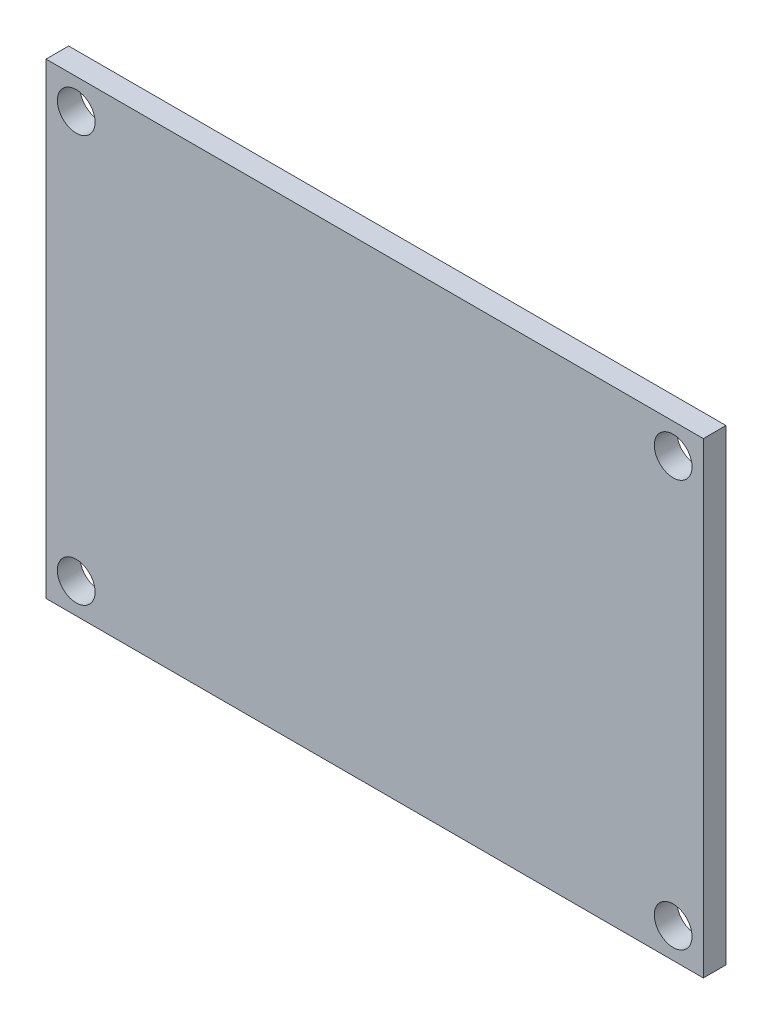
ISO-10303-21;
HEADER;
FILE_DESCRIPTION(('STEP AP214'),'2;1');
FILE_NAME('part.step','',(''),(''),'','','');
FILE_SCHEMA(('AUTOMOTIVE_DESIGN { 1 0 10303 214 1 1 1 1 }'));
ENDSEC;
DATA;
#1=APPLICATION_CONTEXT('core data for automotive mechanical design processes');
#2=APPLICATION_PROTOCOL_DEFINITION('international standard','automotive_design',2000,#1);
#3=PRODUCT_CONTEXT('',#1,'mechanical');
#4=PRODUCT('Part','Part','',(#3));
#5=PRODUCT_RELATED_PRODUCT_CATEGORY('part','',(#4));
#6=PRODUCT_DEFINITION_FORMATION('','',#4);
#7=PRODUCT_DEFINITION_CONTEXT('part definition',#1,'design');
#8=PRODUCT_DEFINITION('design','',#6,#7);
#9=PRODUCT_DEFINITION_SHAPE('','',#8);
#10=(LENGTH_UNIT() NAMED_UNIT(*) SI_UNIT(.MILLI.,.METRE.));
#11=(NAMED_UNIT(*) PLANE_ANGLE_UNIT() SI_UNIT($,.RADIAN.));
#12=(NAMED_UNIT(*) SI_UNIT($,.STERADIAN.) SOLID_ANGLE_UNIT());
#13=UNCERTAINTY_MEASURE_WITH_UNIT(LENGTH_MEASURE(1.E-05),#10,'distance_accuracy_value','');
#14=(GEOMETRIC_REPRESENTATION_CONTEXT(3) GLOBAL_UNCERTAINTY_ASSIGNED_CONTEXT((#13)) GLOBAL_UNIT_ASSIGNED_CONTEXT((#10,
#11,#12)) REPRESENTATION_CONTEXT('',''));
#15=CARTESIAN_POINT('',(0.,0.,0.));
#16=DIRECTION('',(0.,0.,1.));
#17=DIRECTION('',(1.,0.,0.));
#18=AXIS2_PLACEMENT_3D('',#15,#16,#17);
#19=CARTESIAN_POINT('',(-43.55,30.95,3.));
#20=DIRECTION('',(1.,0.,0.));
#21=DIRECTION('',(0.,0.,-1.));
#22=AXIS2_PLACEMENT_3D('',#19,#20,#21);
#23=PLANE('',#22);
#24=DIRECTION('',(0.,-1.,0.));
#25=VECTOR('',#24,1.);
#26=CARTESIAN_POINT('',(-43.55,30.95,0.));
#27=LINE('',#26,#25);
#28=CARTESIAN_POINT('',(-43.55,30.95,0.));
#29=VERTEX_POINT('',#28);
#30=CARTESIAN_POINT('',(-43.55,-30.95,0.));
#31=VERTEX_POINT('',#30);
#32=EDGE_CURVE('E101',#29,#31,#27,.T.);
#33=ORIENTED_EDGE('',*,*,#32,.T.);
#34=DIRECTION('',(0.,0.,-1.));
#35=VECTOR('',#34,1.);
#36=CARTESIAN_POINT('',(-43.55,-30.95,3.));
#37=LINE('',#36,#35);
#38=CARTESIAN_POINT('',(-43.55,-30.95,3.));
#39=VERTEX_POINT('',#38);
#40=EDGE_CURVE('E11',#39,#31,#37,.T.);
#41=ORIENTED_EDGE('',*,*,#40,.F.);
#42=DIRECTION('',(0.,-1.,0.));
#43=VECTOR('',#42,1.);
#44=CARTESIAN_POINT('',(-43.55,30.95,3.));
#45=LINE('',#44,#43);
#46=CARTESIAN_POINT('',(-43.55,30.95,3.));
#47=VERTEX_POINT('',#46);
#48=EDGE_CURVE('E89',#47,#39,#45,.T.);
#49=ORIENTED_EDGE('',*,*,#48,.F.);
#50=DIRECTION('',(0.,0.,-1.));
#51=VECTOR('',#50,1.);
#52=CARTESIAN_POINT('',(-43.55,30.95,3.));
#53=LINE('',#52,#51);
#54=EDGE_CURVE('E97',#47,#29,#53,.T.);
#55=ORIENTED_EDGE('',*,*,#54,.T.);
#56=EDGE_LOOP('',(#33,#41,#49,#55));
#57=FACE_BOUND('',#56,.T.);
#58=ADVANCED_FACE('F38',(#57),#23,.F.);
#59=CARTESIAN_POINT('',(-43.55,-30.95,3.));
#60=DIRECTION('',(0.,1.,0.));
#61=DIRECTION('',(-1.,0.,0.));
#62=AXIS2_PLACEMENT_3D('',#59,#60,#61);
#63=PLANE('',#62);
#64=DIRECTION('',(1.,0.,0.));
#65=VECTOR('',#64,1.);
#66=CARTESIAN_POINT('',(-43.55,-30.95,0.));
#67=LINE('',#66,#65);
#68=CARTESIAN_POINT('',(43.55,-30.95,0.));
#69=VERTEX_POINT('',#68);
#70=EDGE_CURVE('E93',#31,#69,#67,.T.);
#71=ORIENTED_EDGE('',*,*,#70,.T.);
#72=DIRECTION('',(0.,0.,-1.));
#73=VECTOR('',#72,1.);
#74=CARTESIAN_POINT('',(43.55,-30.95,3.));
#75=LINE('',#74,#73);
#76=CARTESIAN_POINT('',(43.55,-30.95,3.));
#77=VERTEX_POINT('',#76);
#78=EDGE_CURVE('E46',#77,#69,#75,.T.);
#79=ORIENTED_EDGE('',*,*,#78,.F.);
#80=DIRECTION('',(1.,0.,0.));
#81=VECTOR('',#80,1.);
#82=CARTESIAN_POINT('',(-43.55,-30.95,3.));
#83=LINE('',#82,#81);
#84=EDGE_CURVE('E84',#39,#77,#83,.T.);
#85=ORIENTED_EDGE('',*,*,#84,.F.);
#86=ORIENTED_EDGE('',*,*,#40,.T.);
#87=EDGE_LOOP('',(#71,#79,#85,#86));
#88=FACE_BOUND('',#87,.T.);
#89=ADVANCED_FACE('F92',(#88),#63,.F.);
#90=CARTESIAN_POINT('',(43.55,30.95,3.));
#91=DIRECTION('',(-1.,0.,0.));
#92=DIRECTION('',(0.,-1.,0.));
#93=AXIS2_PLACEMENT_3D('',#90,#91,#92);
#94=PLANE('',#93);
#95=DIRECTION('',(0.,1.,0.));
#96=VECTOR('',#95,1.);
#97=CARTESIAN_POINT('',(43.55,30.95,0.));
#98=LINE('',#97,#96);
#99=CARTESIAN_POINT('',(43.55,30.95,0.));
#100=VERTEX_POINT('',#99);
#101=EDGE_CURVE('E71',#69,#100,#98,.T.);
#102=ORIENTED_EDGE('',*,*,#101,.T.);
#103=DIRECTION('',(0.,0.,-1.));
#104=VECTOR('',#103,1.);
#105=CARTESIAN_POINT('',(43.55,30.95,3.));
#106=LINE('',#105,#104);
#107=CARTESIAN_POINT('',(43.55,30.95,3.));
#108=VERTEX_POINT('',#107);
#109=EDGE_CURVE('E94',#108,#100,#106,.T.);
#110=ORIENTED_EDGE('',*,*,#109,.F.);
#111=DIRECTION('',(0.,1.,0.));
#112=VECTOR('',#111,1.);
#113=CARTESIAN_POINT('',(43.55,30.95,3.));
#114=LINE('',#113,#112);
#115=EDGE_CURVE('E87',#77,#108,#114,.T.);
#116=ORIENTED_EDGE('',*,*,#115,.F.);
#117=ORIENTED_EDGE('',*,*,#78,.T.);
#118=EDGE_LOOP('',(#102,#110,#116,#117));
#119=FACE_BOUND('',#118,.T.);
#120=ADVANCED_FACE('F95',(#119),#94,.F.);
#121=CARTESIAN_POINT('',(-43.55,30.95,3.));
#122=DIRECTION('',(0.,-1.,0.));
#123=DIRECTION('',(0.,0.,-1.));
#124=AXIS2_PLACEMENT_3D('',#121,#122,#123);
#125=PLANE('',#124);
#126=DIRECTION('',(-1.,0.,0.));
#127=VECTOR('',#126,1.);
#128=CARTESIAN_POINT('',(-43.55,30.95,0.));
#129=LINE('',#128,#127);
#130=EDGE_CURVE('E77',#100,#29,#129,.T.);
#131=ORIENTED_EDGE('',*,*,#130,.T.);
#132=ORIENTED_EDGE('',*,*,#54,.F.);
#133=DIRECTION('',(-1.,0.,0.));
#134=VECTOR('',#133,1.);
#135=CARTESIAN_POINT('',(-43.55,30.95,3.));
#136=LINE('',#135,#134);
#137=EDGE_CURVE('E54',#108,#47,#136,.T.);
#138=ORIENTED_EDGE('',*,*,#137,.F.);
#139=ORIENTED_EDGE('',*,*,#109,.T.);
#140=EDGE_LOOP('',(#131,#132,#138,#139));
#141=FACE_BOUND('',#140,.T.);
#142=ADVANCED_FACE('F109',(#141),#125,.F.);
#143=CARTESIAN_POINT('',(0.,0.,3.));
#144=DIRECTION('',(0.,0.,1.));
#145=DIRECTION('',(1.,0.,0.));
#146=AXIS2_PLACEMENT_3D('',#143,#144,#145);
#147=PLANE('',#146);
#148=CARTESIAN_POINT('',(-39.55,26.95,3.));
#149=DIRECTION('',(0.,0.,-1.));
#150=DIRECTION('',(-1.,0.,0.));
#151=AXIS2_PLACEMENT_3D('',#148,#149,#150);
#152=CIRCLE('',#151,2.5);
#153=CARTESIAN_POINT('',(-42.05,26.95,3.));
#154=VERTEX_POINT('',#153);
#155=EDGE_CURVE('E124',#154,#154,#152,.T.);
#156=ORIENTED_EDGE('',*,*,#155,.T.);
#157=EDGE_LOOP('',(#156));
#158=FACE_BOUND('',#157,.T.);
#159=CARTESIAN_POINT('',(-39.55,-26.95,3.));
#160=DIRECTION('',(0.,0.,-1.));
#161=DIRECTION('',(-1.,0.,0.));
#162=AXIS2_PLACEMENT_3D('',#159,#160,#161);
#163=CIRCLE('',#162,2.50000000000001);
#164=CARTESIAN_POINT('',(-42.05,-26.95,3.));
#165=VERTEX_POINT('',#164);
#166=EDGE_CURVE('E130',#165,#165,#163,.T.);
#167=ORIENTED_EDGE('',*,*,#166,.T.);
#168=EDGE_LOOP('',(#167));
#169=FACE_BOUND('',#168,.T.);
#170=CARTESIAN_POINT('',(39.55,-26.95,3.));
#171=DIRECTION('',(0.,0.,-1.));
#172=DIRECTION('',(-1.,0.,0.));
#173=AXIS2_PLACEMENT_3D('',#170,#171,#172);
#174=CIRCLE('',#173,2.49999999999999);
#175=CARTESIAN_POINT('',(37.05,-26.95,3.));
#176=VERTEX_POINT('',#175);
#177=EDGE_CURVE('E118',#176,#176,#174,.T.);
#178=ORIENTED_EDGE('',*,*,#177,.T.);
#179=EDGE_LOOP('',(#178));
#180=FACE_BOUND('',#179,.T.);
#181=CARTESIAN_POINT('',(39.55,26.95,3.));
#182=DIRECTION('',(0.,0.,-1.));
#183=DIRECTION('',(-1.,0.,0.));
#184=AXIS2_PLACEMENT_3D('',#181,#182,#183);
#185=CIRCLE('',#184,2.5);
#186=CARTESIAN_POINT('',(37.05,26.95,3.));
#187=VERTEX_POINT('',#186);
#188=EDGE_CURVE('E104',#187,#187,#185,.T.);
#189=ORIENTED_EDGE('',*,*,#188,.T.);
#190=EDGE_LOOP('',(#189));
#191=FACE_BOUND('',#190,.T.);
#192=ORIENTED_EDGE('',*,*,#48,.T.);
#193=ORIENTED_EDGE('',*,*,#84,.T.);
#194=ORIENTED_EDGE('',*,*,#115,.T.);
#195=ORIENTED_EDGE('',*,*,#137,.T.);
#196=EDGE_LOOP('',(#192,#193,#194,#195));
#197=FACE_BOUND('',#196,.T.);
#198=ADVANCED_FACE('F85',(#158,#169,#180,#191,#197),#147,.T.);
#199=CARTESIAN_POINT('',(0.,0.,0.));
#200=DIRECTION('',(0.,0.,1.));
#201=DIRECTION('',(1.,0.,0.));
#202=AXIS2_PLACEMENT_3D('',#199,#200,#201);
#203=PLANE('',#202);
#204=CARTESIAN_POINT('',(-39.55,26.95,0.));
#205=DIRECTION('',(0.,0.,-1.));
#206=DIRECTION('',(-1.,0.,0.));
#207=AXIS2_PLACEMENT_3D('',#204,#205,#206);
#208=CIRCLE('',#207,2.5);
#209=CARTESIAN_POINT('',(-42.05,26.95,0.));
#210=VERTEX_POINT('',#209);
#211=EDGE_CURVE('E121',#210,#210,#208,.T.);
#212=ORIENTED_EDGE('',*,*,#211,.F.);
#213=EDGE_LOOP('',(#212));
#214=FACE_BOUND('',#213,.T.);
#215=CARTESIAN_POINT('',(-39.55,-26.95,0.));
#216=DIRECTION('',(0.,0.,-1.));
#217=DIRECTION('',(-1.,0.,0.));
#218=AXIS2_PLACEMENT_3D('',#215,#216,#217);
#219=CIRCLE('',#218,2.50000000000001);
#220=CARTESIAN_POINT('',(-42.05,-26.95,0.));
#221=VERTEX_POINT('',#220);
#222=EDGE_CURVE('E127',#221,#221,#219,.T.);
#223=ORIENTED_EDGE('',*,*,#222,.F.);
#224=EDGE_LOOP('',(#223));
#225=FACE_BOUND('',#224,.T.);
#226=CARTESIAN_POINT('',(39.55,-26.95,0.));
#227=DIRECTION('',(0.,0.,-1.));
#228=DIRECTION('',(-1.,0.,0.));
#229=AXIS2_PLACEMENT_3D('',#226,#227,#228);
#230=CIRCLE('',#229,2.49999999999999);
#231=CARTESIAN_POINT('',(37.05,-26.95,0.));
#232=VERTEX_POINT('',#231);
#233=EDGE_CURVE('E133',#232,#232,#230,.T.);
#234=ORIENTED_EDGE('',*,*,#233,.F.);
#235=EDGE_LOOP('',(#234));
#236=FACE_BOUND('',#235,.T.);
#237=CARTESIAN_POINT('',(39.55,26.95,0.));
#238=DIRECTION('',(0.,0.,-1.));
#239=DIRECTION('',(-1.,0.,0.));
#240=AXIS2_PLACEMENT_3D('',#237,#238,#239);
#241=CIRCLE('',#240,2.5);
#242=CARTESIAN_POINT('',(37.05,26.95,0.));
#243=VERTEX_POINT('',#242);
#244=EDGE_CURVE('E115',#243,#243,#241,.T.);
#245=ORIENTED_EDGE('',*,*,#244,.F.);
#246=EDGE_LOOP('',(#245));
#247=FACE_BOUND('',#246,.T.);
#248=ORIENTED_EDGE('',*,*,#32,.F.);
#249=ORIENTED_EDGE('',*,*,#130,.F.);
#250=ORIENTED_EDGE('',*,*,#101,.F.);
#251=ORIENTED_EDGE('',*,*,#70,.F.);
#252=EDGE_LOOP('',(#248,#249,#250,#251));
#253=FACE_BOUND('',#252,.T.);
#254=ADVANCED_FACE('F112',(#214,#225,#236,#247,#253),#203,.F.);
#255=CARTESIAN_POINT('',(39.55,26.95,3.));
#256=DIRECTION('',(0.,0.,-1.));
#257=DIRECTION('',(-1.,0.,0.));
#258=AXIS2_PLACEMENT_3D('',#255,#256,#257);
#259=CYLINDRICAL_SURFACE('',#258,2.5);
#260=ORIENTED_EDGE('',*,*,#188,.F.);
#261=EDGE_LOOP('',(#260));
#262=FACE_BOUND('',#261,.T.);
#263=ORIENTED_EDGE('',*,*,#244,.T.);
#264=EDGE_LOOP('',(#263));
#265=FACE_BOUND('',#264,.T.);
#266=ADVANCED_FACE('F145',(#262,#265),#259,.F.);
#267=CARTESIAN_POINT('',(39.55,-26.95,3.));
#268=DIRECTION('',(0.,0.,-1.));
#269=DIRECTION('',(-1.,0.,0.));
#270=AXIS2_PLACEMENT_3D('',#267,#268,#269);
#271=CYLINDRICAL_SURFACE('',#270,2.49999999999999);
#272=ORIENTED_EDGE('',*,*,#177,.F.);
#273=EDGE_LOOP('',(#272));
#274=FACE_BOUND('',#273,.T.);
#275=ORIENTED_EDGE('',*,*,#233,.T.);
#276=EDGE_LOOP('',(#275));
#277=FACE_BOUND('',#276,.T.);
#278=ADVANCED_FACE('F141',(#274,#277),#271,.F.);
#279=CARTESIAN_POINT('',(-39.55,-26.95,3.));
#280=DIRECTION('',(0.,0.,-1.));
#281=DIRECTION('',(-1.,0.,0.));
#282=AXIS2_PLACEMENT_3D('',#279,#280,#281);
#283=CYLINDRICAL_SURFACE('',#282,2.50000000000001);
#284=ORIENTED_EDGE('',*,*,#166,.F.);
#285=EDGE_LOOP('',(#284));
#286=FACE_BOUND('',#285,.T.);
#287=ORIENTED_EDGE('',*,*,#222,.T.);
#288=EDGE_LOOP('',(#287));
#289=FACE_BOUND('',#288,.T.);
#290=ADVANCED_FACE('F144',(#286,#289),#283,.F.);
#291=CARTESIAN_POINT('',(-39.55,26.95,3.));
#292=DIRECTION('',(0.,0.,-1.));
#293=DIRECTION('',(-1.,0.,0.));
#294=AXIS2_PLACEMENT_3D('',#291,#292,#293);
#295=CYLINDRICAL_SURFACE('',#294,2.5);
#296=ORIENTED_EDGE('',*,*,#155,.F.);
#297=EDGE_LOOP('',(#296));
#298=FACE_BOUND('',#297,.T.);
#299=ORIENTED_EDGE('',*,*,#211,.T.);
#300=EDGE_LOOP('',(#299));
#301=FACE_BOUND('',#300,.T.);
#302=ADVANCED_FACE('F183',(#298,#301),#295,.F.);
#303=CLOSED_SHELL('',(#58,#89,#120,#142,#198,#254,#266,#278,#290,#302));
#304=MANIFOLD_SOLID_BREP('B2',#303);
#305=ADVANCED_BREP_SHAPE_REPRESENTATION('',(#18,#304),#14);
#306=SHAPE_DEFINITION_REPRESENTATION(#9,#305);
ENDSEC;
END-ISO-10303-21;
